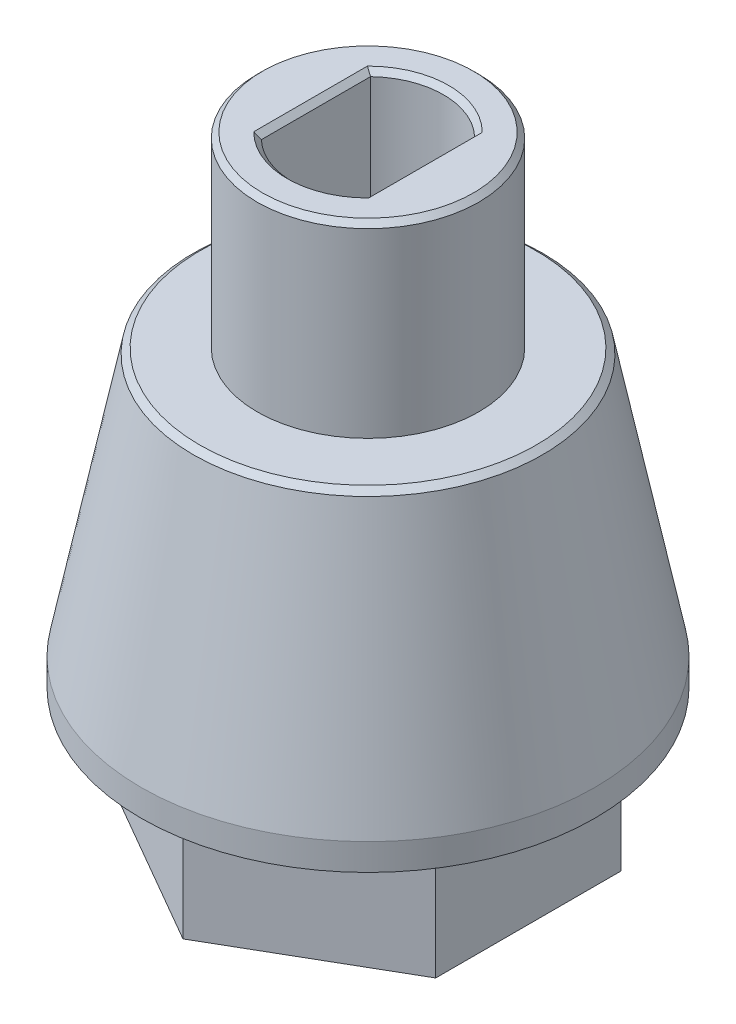
ISO-10303-21;
HEADER;
FILE_DESCRIPTION(('STEP AP214'),'2;1');
FILE_NAME('part.step','',(''),(''),'','','');
FILE_SCHEMA(('AUTOMOTIVE_DESIGN { 1 0 10303 214 1 1 1 1 }'));
ENDSEC;
DATA;
#1=APPLICATION_CONTEXT('core data for automotive mechanical design processes');
#2=APPLICATION_PROTOCOL_DEFINITION('international standard','automotive_design',2000,#1);
#3=PRODUCT_CONTEXT('',#1,'mechanical');
#4=PRODUCT('Part','Part','',(#3));
#5=PRODUCT_RELATED_PRODUCT_CATEGORY('part','',(#4));
#6=PRODUCT_DEFINITION_FORMATION('','',#4);
#7=PRODUCT_DEFINITION_CONTEXT('part definition',#1,'design');
#8=PRODUCT_DEFINITION('design','',#6,#7);
#9=PRODUCT_DEFINITION_SHAPE('','',#8);
#10=(LENGTH_UNIT() NAMED_UNIT(*) SI_UNIT(.MILLI.,.METRE.));
#11=(NAMED_UNIT(*) PLANE_ANGLE_UNIT() SI_UNIT($,.RADIAN.));
#12=(NAMED_UNIT(*) SI_UNIT($,.STERADIAN.) SOLID_ANGLE_UNIT());
#13=UNCERTAINTY_MEASURE_WITH_UNIT(LENGTH_MEASURE(1.E-05),#10,'distance_accuracy_value','');
#14=(GEOMETRIC_REPRESENTATION_CONTEXT(3) GLOBAL_UNCERTAINTY_ASSIGNED_CONTEXT((#13)) GLOBAL_UNIT_ASSIGNED_CONTEXT((#10,
#11,#12)) REPRESENTATION_CONTEXT('',''));
#15=CARTESIAN_POINT('',(0.,0.,0.));
#16=DIRECTION('',(0.,0.,1.));
#17=DIRECTION('',(1.,0.,0.));
#18=AXIS2_PLACEMENT_3D('',#15,#16,#17);
#19=CARTESIAN_POINT('',(0.,15.7,0.));
#20=DIRECTION('',(0.,1.,0.));
#21=DIRECTION('',(0.,0.,1.));
#22=AXIS2_PLACEMENT_3D('',#19,#20,#21);
#23=PLANE('',#22);
#24=CARTESIAN_POINT('',(0.,15.7,0.));
#25=DIRECTION('',(0.,1.,0.));
#26=DIRECTION('',(0.,0.,1.));
#27=AXIS2_PLACEMENT_3D('',#24,#25,#26);
#28=CIRCLE('',#27,6.29999999999999);
#29=CARTESIAN_POINT('',(0.,15.7,6.29999999999999));
#30=VERTEX_POINT('',#29);
#31=EDGE_CURVE('E236',#30,#30,#28,.T.);
#32=ORIENTED_EDGE('',*,*,#31,.T.);
#33=EDGE_LOOP('',(#32));
#34=FACE_BOUND('',#33,.T.);
#35=CARTESIAN_POINT('',(0.,15.7,0.));
#36=DIRECTION('',(0.,1.,0.));
#37=DIRECTION('',(0.,0.,1.));
#38=AXIS2_PLACEMENT_3D('',#35,#36,#37);
#39=CIRCLE('',#38,4.15);
#40=CARTESIAN_POINT('',(0.,15.7,4.15));
#41=VERTEX_POINT('',#40);
#42=EDGE_CURVE('E151',#41,#41,#39,.T.);
#43=ORIENTED_EDGE('',*,*,#42,.F.);
#44=EDGE_LOOP('',(#43));
#45=FACE_BOUND('',#44,.T.);
#46=ADVANCED_FACE('F43',(#34,#45),#23,.T.);
#47=CARTESIAN_POINT('',(-6.00000000000002,4.7,-3.46410161513769));
#48=DIRECTION('',(0.500000000000005,0.,0.866025403784436));
#49=DIRECTION('',(0.866025403784436,0.,-0.500000000000005));
#50=AXIS2_PLACEMENT_3D('',#47,#48,#49);
#51=PLANE('',#50);
#52=DIRECTION('',(-0.866025403784436,0.,0.500000000000005));
#53=VECTOR('',#52,1.);
#54=CARTESIAN_POINT('',(-6.00000000000002,0.,-3.46410161513769));
#55=LINE('',#54,#53);
#56=CARTESIAN_POINT('',(0.,0.,-6.9282032302755));
#57=VERTEX_POINT('',#56);
#58=CARTESIAN_POINT('',(-6.00000000000002,0.,-3.46410161513769));
#59=VERTEX_POINT('',#58);
#60=EDGE_CURVE('E207',#57,#59,#55,.T.);
#61=ORIENTED_EDGE('',*,*,#60,.T.);
#62=DIRECTION('',(0.,-1.,0.));
#63=VECTOR('',#62,1.);
#64=CARTESIAN_POINT('',(-6.00000000000002,4.7,-3.46410161513769));
#65=LINE('',#64,#63);
#66=CARTESIAN_POINT('',(-6.00000000000002,4.7,-3.46410161513769));
#67=VERTEX_POINT('',#66);
#68=EDGE_CURVE('E233',#67,#59,#65,.T.);
#69=ORIENTED_EDGE('',*,*,#68,.F.);
#70=DIRECTION('',(-0.866025403784436,0.,0.500000000000005));
#71=VECTOR('',#70,1.);
#72=CARTESIAN_POINT('',(-6.00000000000002,4.7,-3.46410161513769));
#73=LINE('',#72,#71);
#74=CARTESIAN_POINT('',(0.,4.7,-6.9282032302755));
#75=VERTEX_POINT('',#74);
#76=EDGE_CURVE('E187',#75,#67,#73,.T.);
#77=ORIENTED_EDGE('',*,*,#76,.F.);
#78=DIRECTION('',(0.,-1.,0.));
#79=VECTOR('',#78,1.);
#80=CARTESIAN_POINT('',(0.,4.7,-6.9282032302755));
#81=LINE('',#80,#79);
#82=EDGE_CURVE('E206',#75,#57,#81,.T.);
#83=ORIENTED_EDGE('',*,*,#82,.T.);
#84=EDGE_LOOP('',(#61,#69,#77,#83));
#85=FACE_BOUND('',#84,.T.);
#86=ADVANCED_FACE('F315',(#85),#51,.F.);
#87=CARTESIAN_POINT('',(-5.99999999999997,4.7,3.46410161513778));
#88=DIRECTION('',(1.,0.,0.));
#89=DIRECTION('',(0.,0.,-1.));
#90=AXIS2_PLACEMENT_3D('',#87,#88,#89);
#91=PLANE('',#90);
#92=DIRECTION('',(0.,0.,1.));
#93=VECTOR('',#92,1.);
#94=CARTESIAN_POINT('',(-5.99999999999997,0.,3.46410161513778));
#95=LINE('',#94,#93);
#96=CARTESIAN_POINT('',(-5.99999999999997,0.,3.46410161513778));
#97=VERTEX_POINT('',#96);
#98=EDGE_CURVE('E210',#59,#97,#95,.T.);
#99=ORIENTED_EDGE('',*,*,#98,.T.);
#100=DIRECTION('',(0.,-1.,0.));
#101=VECTOR('',#100,1.);
#102=CARTESIAN_POINT('',(-5.99999999999997,4.7,3.46410161513778));
#103=LINE('',#102,#101);
#104=CARTESIAN_POINT('',(-5.99999999999997,4.7,3.46410161513778));
#105=VERTEX_POINT('',#104);
#106=EDGE_CURVE('E230',#105,#97,#103,.T.);
#107=ORIENTED_EDGE('',*,*,#106,.F.);
#108=DIRECTION('',(0.,0.,1.));
#109=VECTOR('',#108,1.);
#110=CARTESIAN_POINT('',(-5.99999999999997,4.7,3.46410161513778));
#111=LINE('',#110,#109);
#112=EDGE_CURVE('E190',#67,#105,#111,.T.);
#113=ORIENTED_EDGE('',*,*,#112,.F.);
#114=ORIENTED_EDGE('',*,*,#68,.T.);
#115=EDGE_LOOP('',(#99,#107,#113,#114));
#116=FACE_BOUND('',#115,.T.);
#117=ADVANCED_FACE('F321',(#116),#91,.F.);
#118=CARTESIAN_POINT('',(0.,4.7,6.9282032302755));
#119=DIRECTION('',(0.499999999999997,0.,-0.86602540378444));
#120=DIRECTION('',(-0.86602540378444,0.,-0.499999999999997));
#121=AXIS2_PLACEMENT_3D('',#118,#119,#120);
#122=PLANE('',#121);
#123=DIRECTION('',(0.86602540378444,0.,0.499999999999997));
#124=VECTOR('',#123,1.);
#125=CARTESIAN_POINT('',(0.,0.,6.9282032302755));
#126=LINE('',#125,#124);
#127=CARTESIAN_POINT('',(0.,0.,6.9282032302755));
#128=VERTEX_POINT('',#127);
#129=EDGE_CURVE('E212',#97,#128,#126,.T.);
#130=ORIENTED_EDGE('',*,*,#129,.T.);
#131=DIRECTION('',(0.,-1.,0.));
#132=VECTOR('',#131,1.);
#133=CARTESIAN_POINT('',(0.,4.7,6.9282032302755));
#134=LINE('',#133,#132);
#135=CARTESIAN_POINT('',(0.,4.7,6.9282032302755));
#136=VERTEX_POINT('',#135);
#137=EDGE_CURVE('E227',#136,#128,#134,.T.);
#138=ORIENTED_EDGE('',*,*,#137,.F.);
#139=DIRECTION('',(0.86602540378444,0.,0.499999999999997));
#140=VECTOR('',#139,1.);
#141=CARTESIAN_POINT('',(0.,4.7,6.9282032302755));
#142=LINE('',#141,#140);
#143=EDGE_CURVE('E194',#105,#136,#142,.T.);
#144=ORIENTED_EDGE('',*,*,#143,.F.);
#145=ORIENTED_EDGE('',*,*,#106,.T.);
#146=EDGE_LOOP('',(#130,#138,#144,#145));
#147=FACE_BOUND('',#146,.T.);
#148=ADVANCED_FACE('F357',(#147),#122,.F.);
#149=CARTESIAN_POINT('',(6.00000000000003,4.7,3.46410161513769));
#150=DIRECTION('',(-0.500000000000005,0.,-0.866025403784436));
#151=DIRECTION('',(-0.866025403784436,0.,0.500000000000005));
#152=AXIS2_PLACEMENT_3D('',#149,#150,#151);
#153=PLANE('',#152);
#154=DIRECTION('',(0.866025403784436,0.,-0.500000000000005));
#155=VECTOR('',#154,1.);
#156=CARTESIAN_POINT('',(6.00000000000003,0.,3.46410161513769));
#157=LINE('',#156,#155);
#158=CARTESIAN_POINT('',(6.00000000000003,0.,3.46410161513769));
#159=VERTEX_POINT('',#158);
#160=EDGE_CURVE('E214',#128,#159,#157,.T.);
#161=ORIENTED_EDGE('',*,*,#160,.T.);
#162=DIRECTION('',(0.,-1.,0.));
#163=VECTOR('',#162,1.);
#164=CARTESIAN_POINT('',(6.00000000000003,4.7,3.46410161513769));
#165=LINE('',#164,#163);
#166=CARTESIAN_POINT('',(6.00000000000003,4.7,3.46410161513769));
#167=VERTEX_POINT('',#166);
#168=EDGE_CURVE('E224',#167,#159,#165,.T.);
#169=ORIENTED_EDGE('',*,*,#168,.F.);
#170=DIRECTION('',(0.866025403784436,0.,-0.500000000000005));
#171=VECTOR('',#170,1.);
#172=CARTESIAN_POINT('',(6.00000000000003,4.7,3.46410161513769));
#173=LINE('',#172,#171);
#174=EDGE_CURVE('E197',#136,#167,#173,.T.);
#175=ORIENTED_EDGE('',*,*,#174,.F.);
#176=ORIENTED_EDGE('',*,*,#137,.T.);
#177=EDGE_LOOP('',(#161,#169,#175,#176));
#178=FACE_BOUND('',#177,.T.);
#179=ADVANCED_FACE('F353',(#178),#153,.F.);
#180=CARTESIAN_POINT('',(5.99999999999997,4.7,-3.46410161513778));
#181=DIRECTION('',(-1.,0.,0.));
#182=DIRECTION('',(0.,0.,1.));
#183=AXIS2_PLACEMENT_3D('',#180,#181,#182);
#184=PLANE('',#183);
#185=DIRECTION('',(0.,0.,-1.));
#186=VECTOR('',#185,1.);
#187=CARTESIAN_POINT('',(5.99999999999997,0.,-3.46410161513778));
#188=LINE('',#187,#186);
#189=CARTESIAN_POINT('',(5.99999999999997,0.,-3.46410161513778));
#190=VERTEX_POINT('',#189);
#191=EDGE_CURVE('E216',#159,#190,#188,.T.);
#192=ORIENTED_EDGE('',*,*,#191,.T.);
#193=DIRECTION('',(0.,-1.,0.));
#194=VECTOR('',#193,1.);
#195=CARTESIAN_POINT('',(5.99999999999997,4.7,-3.46410161513778));
#196=LINE('',#195,#194);
#197=CARTESIAN_POINT('',(5.99999999999997,4.7,-3.46410161513778));
#198=VERTEX_POINT('',#197);
#199=EDGE_CURVE('E221',#198,#190,#196,.T.);
#200=ORIENTED_EDGE('',*,*,#199,.F.);
#201=DIRECTION('',(0.,0.,-1.));
#202=VECTOR('',#201,1.);
#203=CARTESIAN_POINT('',(5.99999999999997,4.7,-3.46410161513778));
#204=LINE('',#203,#202);
#205=EDGE_CURVE('E200',#167,#198,#204,.T.);
#206=ORIENTED_EDGE('',*,*,#205,.F.);
#207=ORIENTED_EDGE('',*,*,#168,.T.);
#208=EDGE_LOOP('',(#192,#200,#206,#207));
#209=FACE_BOUND('',#208,.T.);
#210=ADVANCED_FACE('F349',(#209),#184,.F.);
#211=CARTESIAN_POINT('',(0.,4.7,-6.9282032302755));
#212=DIRECTION('',(-0.499999999999997,0.,0.86602540378444));
#213=DIRECTION('',(0.86602540378444,0.,0.499999999999997));
#214=AXIS2_PLACEMENT_3D('',#211,#212,#213);
#215=PLANE('',#214);
#216=DIRECTION('',(-0.86602540378444,0.,-0.499999999999997));
#217=VECTOR('',#216,1.);
#218=CARTESIAN_POINT('',(0.,0.,-6.9282032302755));
#219=LINE('',#218,#217);
#220=EDGE_CURVE('E191',#190,#57,#219,.T.);
#221=ORIENTED_EDGE('',*,*,#220,.T.);
#222=ORIENTED_EDGE('',*,*,#82,.F.);
#223=DIRECTION('',(-0.86602540378444,0.,-0.499999999999997));
#224=VECTOR('',#223,1.);
#225=CARTESIAN_POINT('',(0.,4.7,-6.9282032302755));
#226=LINE('',#225,#224);
#227=EDGE_CURVE('E203',#198,#75,#226,.T.);
#228=ORIENTED_EDGE('',*,*,#227,.F.);
#229=ORIENTED_EDGE('',*,*,#199,.T.);
#230=EDGE_LOOP('',(#221,#222,#228,#229));
#231=FACE_BOUND('',#230,.T.);
#232=ADVANCED_FACE('F345',(#231),#215,.F.);
#233=CARTESIAN_POINT('',(0.,0.,0.));
#234=DIRECTION('',(0.,-1.,0.));
#235=DIRECTION('',(0.,0.,-1.));
#236=AXIS2_PLACEMENT_3D('',#233,#234,#235);
#237=PLANE('',#236);
#238=CARTESIAN_POINT('',(0.,0.,0.));
#239=DIRECTION('',(0.,-1.,0.));
#240=DIRECTION('',(0.,0.,-1.));
#241=AXIS2_PLACEMENT_3D('',#238,#239,#240);
#242=CIRCLE('',#241,0.75);
#243=CARTESIAN_POINT('',(0.,0.,-0.75));
#244=VERTEX_POINT('',#243);
#245=EDGE_CURVE('E169',#244,#244,#242,.T.);
#246=ORIENTED_EDGE('',*,*,#245,.F.);
#247=EDGE_LOOP('',(#246));
#248=FACE_BOUND('',#247,.T.);
#249=ORIENTED_EDGE('',*,*,#60,.F.);
#250=ORIENTED_EDGE('',*,*,#220,.F.);
#251=ORIENTED_EDGE('',*,*,#191,.F.);
#252=ORIENTED_EDGE('',*,*,#160,.F.);
#253=ORIENTED_EDGE('',*,*,#129,.F.);
#254=ORIENTED_EDGE('',*,*,#98,.F.);
#255=EDGE_LOOP('',(#249,#250,#251,#252,#253,#254));
#256=FACE_BOUND('',#255,.T.);
#257=ADVANCED_FACE('F338',(#248,#256),#237,.T.);
#258=CARTESIAN_POINT('',(0.,4.7,0.));
#259=DIRECTION('',(0.,1.,0.));
#260=DIRECTION('',(0.,0.,1.));
#261=AXIS2_PLACEMENT_3D('',#258,#259,#260);
#262=PLANE('',#261);
#263=CARTESIAN_POINT('',(0.,4.7,0.));
#264=DIRECTION('',(0.,1.,0.));
#265=DIRECTION('',(0.,0.,1.));
#266=AXIS2_PLACEMENT_3D('',#263,#264,#265);
#267=CIRCLE('',#266,8.5);
#268=CARTESIAN_POINT('',(0.,4.7,8.5));
#269=VERTEX_POINT('',#268);
#270=EDGE_CURVE('E183',#269,#269,#267,.T.);
#271=ORIENTED_EDGE('',*,*,#270,.F.);
#272=EDGE_LOOP('',(#271));
#273=FACE_BOUND('',#272,.T.);
#274=ORIENTED_EDGE('',*,*,#227,.T.);
#275=ORIENTED_EDGE('',*,*,#76,.T.);
#276=ORIENTED_EDGE('',*,*,#112,.T.);
#277=ORIENTED_EDGE('',*,*,#143,.T.);
#278=ORIENTED_EDGE('',*,*,#174,.T.);
#279=ORIENTED_EDGE('',*,*,#205,.T.);
#280=EDGE_LOOP('',(#274,#275,#276,#277,#278,#279));
#281=FACE_BOUND('',#280,.T.);
#282=ADVANCED_FACE('F335',(#273,#281),#262,.F.);
#283=CARTESIAN_POINT('',(0.,5.7,0.));
#284=DIRECTION('',(0.,-1.,0.));
#285=DIRECTION('',(0.,0.,-1.));
#286=AXIS2_PLACEMENT_3D('',#283,#284,#285);
#287=CYLINDRICAL_SURFACE('',#286,8.5);
#288=CARTESIAN_POINT('',(0.,5.7,0.));
#289=DIRECTION('',(0.,-1.,0.));
#290=DIRECTION('',(0.,0.,-1.));
#291=AXIS2_PLACEMENT_3D('',#288,#289,#290);
#292=CIRCLE('',#291,8.5);
#293=CARTESIAN_POINT('',(0.,5.7,-8.5));
#294=VERTEX_POINT('',#293);
#295=EDGE_CURVE('E186',#294,#294,#292,.F.);
#296=ORIENTED_EDGE('',*,*,#295,.F.);
#297=EDGE_LOOP('',(#296));
#298=FACE_BOUND('',#297,.T.);
#299=ORIENTED_EDGE('',*,*,#270,.T.);
#300=EDGE_LOOP('',(#299));
#301=FACE_BOUND('',#300,.T.);
#302=ADVANCED_FACE('F333',(#298,#301),#287,.T.);
#303=CARTESIAN_POINT('',(0.,15.7,0.));
#304=DIRECTION('',(0.,-1.,0.));
#305=DIRECTION('',(0.,0.,-1.));
#306=AXIS2_PLACEMENT_3D('',#303,#304,#305);
#307=CONICAL_SURFACE('',#306,6.5,0.197395559849881);
#308=CARTESIAN_POINT('',(0.,15.5038838648618,0.));
#309=DIRECTION('',(0.,1.,0.));
#310=DIRECTION('',(0.,0.,1.));
#311=AXIS2_PLACEMENT_3D('',#308,#309,#310);
#312=CIRCLE('',#311,6.53922322702764);
#313=CARTESIAN_POINT('',(0.,15.5038838648618,6.53922322702764));
#314=VERTEX_POINT('',#313);
#315=EDGE_CURVE('E243',#314,#314,#312,.F.);
#316=ORIENTED_EDGE('',*,*,#315,.T.);
#317=EDGE_LOOP('',(#316));
#318=FACE_BOUND('',#317,.T.);
#319=ORIENTED_EDGE('',*,*,#295,.T.);
#320=EDGE_LOOP('',(#319));
#321=FACE_BOUND('',#320,.T.);
#322=ADVANCED_FACE('F329',(#318,#321),#307,.T.);
#323=CARTESIAN_POINT('',(0.,22.7,0.));
#324=DIRECTION('',(0.,1.,0.));
#325=DIRECTION('',(0.,0.,1.));
#326=AXIS2_PLACEMENT_3D('',#323,#324,#325);
#327=PLANE('',#326);
#328=CARTESIAN_POINT('',(0.,22.7,0.));
#329=DIRECTION('',(0.,1.,0.));
#330=DIRECTION('',(0.,0.,1.));
#331=AXIS2_PLACEMENT_3D('',#328,#329,#330);
#332=CIRCLE('',#331,3.02500000000001);
#333=CARTESIAN_POINT('',(2.15,22.7,2.12793914386668));
#334=VERTEX_POINT('',#333);
#335=CARTESIAN_POINT('',(-2.15,22.7,2.12793914386668));
#336=VERTEX_POINT('',#335);
#337=EDGE_CURVE('E251',#334,#336,#332,.F.);
#338=ORIENTED_EDGE('',*,*,#337,.T.);
#339=DIRECTION('',(0.,0.,-1.));
#340=VECTOR('',#339,1.);
#341=CARTESIAN_POINT('',(-2.15000000000001,22.7,0.));
#342=LINE('',#341,#340);
#343=CARTESIAN_POINT('',(-2.15,22.7,-2.12793914386668));
#344=VERTEX_POINT('',#343);
#345=EDGE_CURVE('E257',#336,#344,#342,.T.);
#346=ORIENTED_EDGE('',*,*,#345,.T.);
#347=CARTESIAN_POINT('',(0.,22.7,0.));
#348=DIRECTION('',(0.,1.,0.));
#349=DIRECTION('',(0.,0.,1.));
#350=AXIS2_PLACEMENT_3D('',#347,#348,#349);
#351=CIRCLE('',#350,3.02500000000001);
#352=CARTESIAN_POINT('',(2.15000000000001,22.7,-2.12793914386668));
#353=VERTEX_POINT('',#352);
#354=EDGE_CURVE('E255',#344,#353,#351,.F.);
#355=ORIENTED_EDGE('',*,*,#354,.T.);
#356=DIRECTION('',(0.,0.,1.));
#357=VECTOR('',#356,1.);
#358=CARTESIAN_POINT('',(2.15000000000001,22.7,0.));
#359=LINE('',#358,#357);
#360=EDGE_CURVE('E253',#353,#334,#359,.T.);
#361=ORIENTED_EDGE('',*,*,#360,.T.);
#362=EDGE_LOOP('',(#338,#346,#355,#361));
#363=FACE_BOUND('',#362,.T.);
#364=CARTESIAN_POINT('',(0.,22.7,0.));
#365=DIRECTION('',(0.,1.,0.));
#366=DIRECTION('',(0.,0.,1.));
#367=AXIS2_PLACEMENT_3D('',#364,#365,#366);
#368=CIRCLE('',#367,3.95);
#369=CARTESIAN_POINT('',(0.,22.7,3.95));
#370=VERTEX_POINT('',#369);
#371=EDGE_CURVE('E248',#370,#370,#368,.T.);
#372=ORIENTED_EDGE('',*,*,#371,.T.);
#373=EDGE_LOOP('',(#372));
#374=FACE_BOUND('',#373,.T.);
#375=ADVANCED_FACE('F332',(#363,#374),#327,.T.);
#376=CARTESIAN_POINT('',(0.,22.7,0.));
#377=DIRECTION('',(0.,-1.,0.));
#378=DIRECTION('',(0.,0.,-1.));
#379=AXIS2_PLACEMENT_3D('',#376,#377,#378);
#380=CYLINDRICAL_SURFACE('',#379,4.15);
#381=CARTESIAN_POINT('',(0.,22.5,0.));
#382=DIRECTION('',(0.,1.,0.));
#383=DIRECTION('',(0.,0.,1.));
#384=AXIS2_PLACEMENT_3D('',#381,#382,#383);
#385=CIRCLE('',#384,4.15);
#386=CARTESIAN_POINT('',(0.,22.5,4.15));
#387=VERTEX_POINT('',#386);
#388=EDGE_CURVE('E12',#387,#387,#385,.F.);
#389=ORIENTED_EDGE('',*,*,#388,.T.);
#390=EDGE_LOOP('',(#389));
#391=FACE_BOUND('',#390,.T.);
#392=ORIENTED_EDGE('',*,*,#42,.T.);
#393=EDGE_LOOP('',(#392));
#394=FACE_BOUND('',#393,.T.);
#395=ADVANCED_FACE('F327',(#391,#394),#380,.T.);
#396=CARTESIAN_POINT('',(0.,22.7,0.));
#397=DIRECTION('',(0.,-1.,0.));
#398=DIRECTION('',(0.,0.,-1.));
#399=AXIS2_PLACEMENT_3D('',#396,#397,#398);
#400=CYLINDRICAL_SURFACE('',#399,2.825);
#401=DIRECTION('',(0.,-1.,0.));
#402=VECTOR('',#401,1.);
#403=CARTESIAN_POINT('',(1.95,22.7,-2.04404623235386));
#404=LINE('',#403,#402);
#405=CARTESIAN_POINT('',(1.95,22.5,-2.04404623235386));
#406=VERTEX_POINT('',#405);
#407=CARTESIAN_POINT('',(1.95,14.7,-2.04404623235386));
#408=VERTEX_POINT('',#407);
#409=EDGE_CURVE('E176',#406,#408,#404,.T.);
#410=ORIENTED_EDGE('',*,*,#409,.F.);
#411=CARTESIAN_POINT('',(0.,22.5,0.));
#412=DIRECTION('',(0.,1.,0.));
#413=DIRECTION('',(0.,0.,1.));
#414=AXIS2_PLACEMENT_3D('',#411,#412,#413);
#415=CIRCLE('',#414,2.825);
#416=CARTESIAN_POINT('',(-1.95,22.5,-2.04404623235386));
#417=VERTEX_POINT('',#416);
#418=EDGE_CURVE('E147',#406,#417,#415,.T.);
#419=ORIENTED_EDGE('',*,*,#418,.T.);
#420=DIRECTION('',(0.,-1.,0.));
#421=VECTOR('',#420,1.);
#422=CARTESIAN_POINT('',(-1.95,22.7,-2.04404623235386));
#423=LINE('',#422,#421);
#424=CARTESIAN_POINT('',(-1.95,14.7,-2.04404623235386));
#425=VERTEX_POINT('',#424);
#426=EDGE_CURVE('E140',#417,#425,#423,.T.);
#427=ORIENTED_EDGE('',*,*,#426,.T.);
#428=CARTESIAN_POINT('',(0.,14.7,0.));
#429=DIRECTION('',(0.,1.,0.));
#430=DIRECTION('',(0.,0.,1.));
#431=AXIS2_PLACEMENT_3D('',#428,#429,#430);
#432=CIRCLE('',#431,2.825);
#433=EDGE_CURVE('E144',#408,#425,#432,.T.);
#434=ORIENTED_EDGE('',*,*,#433,.F.);
#435=EDGE_LOOP('',(#410,#419,#427,#434));
#436=FACE_BOUND('',#435,.T.);
#437=ADVANCED_FACE('F142',(#436),#400,.F.);
#438=CARTESIAN_POINT('',(-1.95,22.7,-2.04404623235386));
#439=DIRECTION('',(1.,0.,0.));
#440=DIRECTION('',(0.,0.,-1.));
#441=AXIS2_PLACEMENT_3D('',#438,#439,#440);
#442=PLANE('',#441);
#443=ORIENTED_EDGE('',*,*,#426,.F.);
#444=DIRECTION('',(0.,0.,1.));
#445=VECTOR('',#444,1.);
#446=CARTESIAN_POINT('',(-1.95,22.5,-2.04404623235386));
#447=LINE('',#446,#445);
#448=CARTESIAN_POINT('',(-1.95,22.5,2.04404623235386));
#449=VERTEX_POINT('',#448);
#450=EDGE_CURVE('E246',#417,#449,#447,.T.);
#451=ORIENTED_EDGE('',*,*,#450,.T.);
#452=DIRECTION('',(0.,-1.,0.));
#453=VECTOR('',#452,1.);
#454=CARTESIAN_POINT('',(-1.95,22.7,2.04404623235386));
#455=LINE('',#454,#453);
#456=CARTESIAN_POINT('',(-1.95,14.7,2.04404623235386));
#457=VERTEX_POINT('',#456);
#458=EDGE_CURVE('E152',#449,#457,#455,.T.);
#459=ORIENTED_EDGE('',*,*,#458,.T.);
#460=DIRECTION('',(0.,0.,1.));
#461=VECTOR('',#460,1.);
#462=CARTESIAN_POINT('',(-1.95,14.7,-2.04404623235386));
#463=LINE('',#462,#461);
#464=EDGE_CURVE('E155',#425,#457,#463,.T.);
#465=ORIENTED_EDGE('',*,*,#464,.F.);
#466=EDGE_LOOP('',(#443,#451,#459,#465));
#467=FACE_BOUND('',#466,.T.);
#468=ADVANCED_FACE('F156',(#467),#442,.T.);
#469=CARTESIAN_POINT('',(0.,22.7,0.));
#470=DIRECTION('',(0.,-1.,0.));
#471=DIRECTION('',(0.,0.,-1.));
#472=AXIS2_PLACEMENT_3D('',#469,#470,#471);
#473=CYLINDRICAL_SURFACE('',#472,2.825);
#474=ORIENTED_EDGE('',*,*,#458,.F.);
#475=CARTESIAN_POINT('',(0.,22.5,0.));
#476=DIRECTION('',(0.,1.,0.));
#477=DIRECTION('',(0.,0.,1.));
#478=AXIS2_PLACEMENT_3D('',#475,#476,#477);
#479=CIRCLE('',#478,2.825);
#480=CARTESIAN_POINT('',(1.95,22.5,2.04404623235386));
#481=VERTEX_POINT('',#480);
#482=EDGE_CURVE('E58',#449,#481,#479,.T.);
#483=ORIENTED_EDGE('',*,*,#482,.T.);
#484=DIRECTION('',(0.,-1.,0.));
#485=VECTOR('',#484,1.);
#486=CARTESIAN_POINT('',(1.95,22.7,2.04404623235386));
#487=LINE('',#486,#485);
#488=CARTESIAN_POINT('',(1.95,14.7,2.04404623235386));
#489=VERTEX_POINT('',#488);
#490=EDGE_CURVE('E178',#481,#489,#487,.T.);
#491=ORIENTED_EDGE('',*,*,#490,.T.);
#492=CARTESIAN_POINT('',(0.,14.7,0.));
#493=DIRECTION('',(0.,1.,0.));
#494=DIRECTION('',(0.,0.,1.));
#495=AXIS2_PLACEMENT_3D('',#492,#493,#494);
#496=CIRCLE('',#495,2.825);
#497=EDGE_CURVE('E160',#457,#489,#496,.T.);
#498=ORIENTED_EDGE('',*,*,#497,.F.);
#499=EDGE_LOOP('',(#474,#483,#491,#498));
#500=FACE_BOUND('',#499,.T.);
#501=ADVANCED_FACE('F500',(#500),#473,.F.);
#502=CARTESIAN_POINT('',(1.95,22.7,-2.04404623235386));
#503=DIRECTION('',(-1.,0.,0.));
#504=DIRECTION('',(0.,0.,1.));
#505=AXIS2_PLACEMENT_3D('',#502,#503,#504);
#506=PLANE('',#505);
#507=ORIENTED_EDGE('',*,*,#490,.F.);
#508=DIRECTION('',(0.,0.,-1.));
#509=VECTOR('',#508,1.);
#510=CARTESIAN_POINT('',(1.95,22.5,-2.04404623235386));
#511=LINE('',#510,#509);
#512=EDGE_CURVE('E72',#481,#406,#511,.T.);
#513=ORIENTED_EDGE('',*,*,#512,.T.);
#514=ORIENTED_EDGE('',*,*,#409,.T.);
#515=DIRECTION('',(0.,0.,-1.));
#516=VECTOR('',#515,1.);
#517=CARTESIAN_POINT('',(1.95,14.7,2.04404623235386));
#518=LINE('',#517,#516);
#519=EDGE_CURVE('E164',#489,#408,#518,.T.);
#520=ORIENTED_EDGE('',*,*,#519,.F.);
#521=EDGE_LOOP('',(#507,#513,#514,#520));
#522=FACE_BOUND('',#521,.T.);
#523=ADVANCED_FACE('F311',(#522),#506,.T.);
#524=CARTESIAN_POINT('',(0.,15.7,0.));
#525=DIRECTION('',(0.,-1.,0.));
#526=DIRECTION('',(0.,0.,-1.));
#527=AXIS2_PLACEMENT_3D('',#524,#525,#526);
#528=CONICAL_SURFACE('',#527,6.29999999999999,0.884095943322393);
#529=ORIENTED_EDGE('',*,*,#315,.F.);
#530=EDGE_LOOP('',(#529));
#531=FACE_BOUND('',#530,.T.);
#532=ORIENTED_EDGE('',*,*,#31,.F.);
#533=EDGE_LOOP('',(#532));
#534=FACE_BOUND('',#533,.T.);
#535=ADVANCED_FACE('F303',(#531,#534),#528,.T.);
#536=CARTESIAN_POINT('',(1.95,22.5,-2.04404623235386));
#537=DIRECTION('',(0.707106781186539,-0.707106781186556,0.));
#538=DIRECTION('',(0.,0.,-1.));
#539=AXIS2_PLACEMENT_3D('',#536,#537,#538);
#540=PLANE('',#539);
#541=CARTESIAN_POINT('',(2.15000000000001,22.7,2.12793914386668));
#542=CARTESIAN_POINT('',(2.11661247943741,22.6666124794374,2.11421540016816));
#543=CARTESIAN_POINT('',(2.0832520567636,22.6332520567636,2.10036245418846));
#544=CARTESIAN_POINT('',(2.01658539006908,22.5665853900691,2.07239815048361));
#545=CARTESIAN_POINT('',(1.98327914607623,22.5332791460762,2.05828679262571));
#546=CARTESIAN_POINT('',(1.95,22.5,2.04404623235388));
#547=B_SPLINE_CURVE_WITH_KNOTS('',3,(#541,#542,#543,#544,#545,#546),.UNSPECIFIED.,.F.,.F.,(4,2,
4),(0.,0.147511550152543,0.295023176086754),.UNSPECIFIED.);
#548=EDGE_CURVE('E290',#334,#481,#547,.T.);
#549=ORIENTED_EDGE('',*,*,#548,.F.);
#550=ORIENTED_EDGE('',*,*,#360,.F.);
#551=CARTESIAN_POINT('',(2.15,22.7,-2.12793914386668));
#552=CARTESIAN_POINT('',(2.1166124794374,22.6666124794374,-2.11421540016815));
#553=CARTESIAN_POINT('',(2.08325205676359,22.6332520567636,-2.10036245418846));
#554=CARTESIAN_POINT('',(2.01658539006908,22.5665853900691,-2.07239815048361));
#555=CARTESIAN_POINT('',(1.98327914607623,22.5332791460762,-2.05828679262571));
#556=CARTESIAN_POINT('',(1.95,22.5,-2.04404623235388));
#557=B_SPLINE_CURVE_WITH_KNOTS('',3,(#551,#552,#553,#554,#555,#556),.UNSPECIFIED.,.F.,.F.,(4,2,
4),(0.,0.14751155015254,0.295023176086747),.UNSPECIFIED.);
#558=EDGE_CURVE('E48',#406,#353,#557,.F.);
#559=ORIENTED_EDGE('',*,*,#558,.F.);
#560=ORIENTED_EDGE('',*,*,#512,.F.);
#561=EDGE_LOOP('',(#549,#550,#559,#560));
#562=FACE_BOUND('',#561,.T.);
#563=ADVANCED_FACE('F297',(#562),#540,.F.);
#564=CARTESIAN_POINT('',(0.,22.5,0.));
#565=DIRECTION('',(0.,1.,0.));
#566=DIRECTION('',(0.,0.,1.));
#567=AXIS2_PLACEMENT_3D('',#564,#565,#566);
#568=CONICAL_SURFACE('',#567,2.825,0.78539816339746);
#569=ORIENTED_EDGE('',*,*,#558,.T.);
#570=ORIENTED_EDGE('',*,*,#354,.F.);
#571=CARTESIAN_POINT('',(-2.15000000000001,22.7,-2.12793914386668));
#572=CARTESIAN_POINT('',(-2.11661247943741,22.6666124794374,-2.11421540016816));
#573=CARTESIAN_POINT('',(-2.0832520567636,22.6332520567636,-2.10036245418846));
#574=CARTESIAN_POINT('',(-2.01658539006908,22.5665853900691,-2.07239815048361));
#575=CARTESIAN_POINT('',(-1.98327914607623,22.5332791460762,-2.05828679262571));
#576=CARTESIAN_POINT('',(-1.95,22.5,-2.04404623235388));
#577=B_SPLINE_CURVE_WITH_KNOTS('',3,(#571,#572,#573,#574,#575,#576),.UNSPECIFIED.,.F.,.F.,(4,2,
4),(0.,0.147511550152543,0.295023176086754),.UNSPECIFIED.);
#578=EDGE_CURVE('E270',#417,#344,#577,.F.);
#579=ORIENTED_EDGE('',*,*,#578,.F.);
#580=ORIENTED_EDGE('',*,*,#418,.F.);
#581=EDGE_LOOP('',(#569,#570,#579,#580));
#582=FACE_BOUND('',#581,.T.);
#583=ADVANCED_FACE('F286',(#582),#568,.F.);
#584=CARTESIAN_POINT('',(0.,22.5,0.));
#585=DIRECTION('',(0.,1.,0.));
#586=DIRECTION('',(0.,0.,1.));
#587=AXIS2_PLACEMENT_3D('',#584,#585,#586);
#588=CONICAL_SURFACE('',#587,2.825,0.78539816339746);
#589=ORIENTED_EDGE('',*,*,#548,.T.);
#590=ORIENTED_EDGE('',*,*,#482,.F.);
#591=CARTESIAN_POINT('',(-1.95,22.5,2.04404623235386));
#592=CARTESIAN_POINT('',(-1.98327914607623,22.5332791460762,2.05828679262569));
#593=CARTESIAN_POINT('',(-2.01658539006908,22.5665853900691,2.0723981504836));
#594=CARTESIAN_POINT('',(-2.08325205676359,22.6332520567636,2.10036245418847));
#595=CARTESIAN_POINT('',(-2.11661247943741,22.6666124794374,2.11421540016817));
#596=CARTESIAN_POINT('',(-2.15000000000001,22.7,2.1279391438667));
#597=B_SPLINE_CURVE_WITH_KNOTS('',3,(#591,#592,#593,#594,#595,#596),.UNSPECIFIED.,.F.,.F.,(4,2,
4),(0.,0.147511625934212,0.295023176086755),.UNSPECIFIED.);
#598=EDGE_CURVE('E173',#336,#449,#597,.F.);
#599=ORIENTED_EDGE('',*,*,#598,.F.);
#600=ORIENTED_EDGE('',*,*,#337,.F.);
#601=EDGE_LOOP('',(#589,#590,#599,#600));
#602=FACE_BOUND('',#601,.T.);
#603=ADVANCED_FACE('F280',(#602),#588,.F.);
#604=CARTESIAN_POINT('',(-1.95,22.5,-2.04404623235386));
#605=DIRECTION('',(-0.707106781186539,-0.707106781186556,0.));
#606=DIRECTION('',(0.,0.,1.));
#607=AXIS2_PLACEMENT_3D('',#604,#605,#606);
#608=PLANE('',#607);
#609=ORIENTED_EDGE('',*,*,#578,.T.);
#610=ORIENTED_EDGE('',*,*,#345,.F.);
#611=ORIENTED_EDGE('',*,*,#598,.T.);
#612=ORIENTED_EDGE('',*,*,#450,.F.);
#613=EDGE_LOOP('',(#609,#610,#611,#612));
#614=FACE_BOUND('',#613,.T.);
#615=ADVANCED_FACE('F276',(#614),#608,.F.);
#616=CARTESIAN_POINT('',(0.,22.7,0.));
#617=DIRECTION('',(0.,-1.,0.));
#618=DIRECTION('',(0.,0.,-1.));
#619=AXIS2_PLACEMENT_3D('',#616,#617,#618);
#620=CONICAL_SURFACE('',#619,3.95,0.785398163397446);
#621=ORIENTED_EDGE('',*,*,#388,.F.);
#622=EDGE_LOOP('',(#621));
#623=FACE_BOUND('',#622,.T.);
#624=ORIENTED_EDGE('',*,*,#371,.F.);
#625=EDGE_LOOP('',(#624));
#626=FACE_BOUND('',#625,.T.);
#627=ADVANCED_FACE('F46',(#623,#626),#620,.T.);
#628=CARTESIAN_POINT('',(0.,7.,0.));
#629=DIRECTION('',(0.,-1.,0.));
#630=DIRECTION('',(0.,0.,-1.));
#631=AXIS2_PLACEMENT_3D('',#628,#629,#630);
#632=CYLINDRICAL_SURFACE('',#631,0.75);
#633=CARTESIAN_POINT('',(0.,7.,0.));
#634=DIRECTION('',(0.,-1.,0.));
#635=DIRECTION('',(0.,0.,-1.));
#636=AXIS2_PLACEMENT_3D('',#633,#634,#635);
#637=CIRCLE('',#636,0.75);
#638=CARTESIAN_POINT('',(0.,7.,-0.75));
#639=VERTEX_POINT('',#638);
#640=EDGE_CURVE('E170',#639,#639,#637,.T.);
#641=ORIENTED_EDGE('',*,*,#640,.F.);
#642=EDGE_LOOP('',(#641));
#643=FACE_BOUND('',#642,.T.);
#644=ORIENTED_EDGE('',*,*,#245,.T.);
#645=EDGE_LOOP('',(#644));
#646=FACE_BOUND('',#645,.T.);
#647=ADVANCED_FACE('F470',(#643,#646),#632,.F.);
#648=CARTESIAN_POINT('',(0.,7.,0.));
#649=DIRECTION('',(0.,-1.,0.));
#650=DIRECTION('',(0.,0.,-1.));
#651=AXIS2_PLACEMENT_3D('',#648,#649,#650);
#652=PLANE('',#651);
#653=ORIENTED_EDGE('',*,*,#640,.T.);
#654=EDGE_LOOP('',(#653));
#655=FACE_BOUND('',#654,.T.);
#656=ADVANCED_FACE('F480',(#655),#652,.T.);
#657=CARTESIAN_POINT('',(0.,14.7,0.));
#658=DIRECTION('',(0.,1.,0.));
#659=DIRECTION('',(0.,0.,1.));
#660=AXIS2_PLACEMENT_3D('',#657,#658,#659);
#661=PLANE('',#660);
#662=ORIENTED_EDGE('',*,*,#433,.T.);
#663=ORIENTED_EDGE('',*,*,#464,.T.);
#664=ORIENTED_EDGE('',*,*,#497,.T.);
#665=ORIENTED_EDGE('',*,*,#519,.T.);
#666=EDGE_LOOP('',(#662,#663,#664,#665));
#667=FACE_BOUND('',#666,.T.);
#668=ADVANCED_FACE('F162',(#667),#661,.T.);
#669=CLOSED_SHELL('',(#46,#86,#117,#148,#179,#210,#232,#257,#282,#302,#322,#375,#395,#437,#468,
#501,#523,#535,#563,#583,#603,#615,#627,#647,#656,#668));
#670=MANIFOLD_SOLID_BREP('B2',#669);
#671=ADVANCED_BREP_SHAPE_REPRESENTATION('',(#18,#670),#14);
#672=SHAPE_DEFINITION_REPRESENTATION(#9,#671);
ENDSEC;
END-ISO-10303-21;
